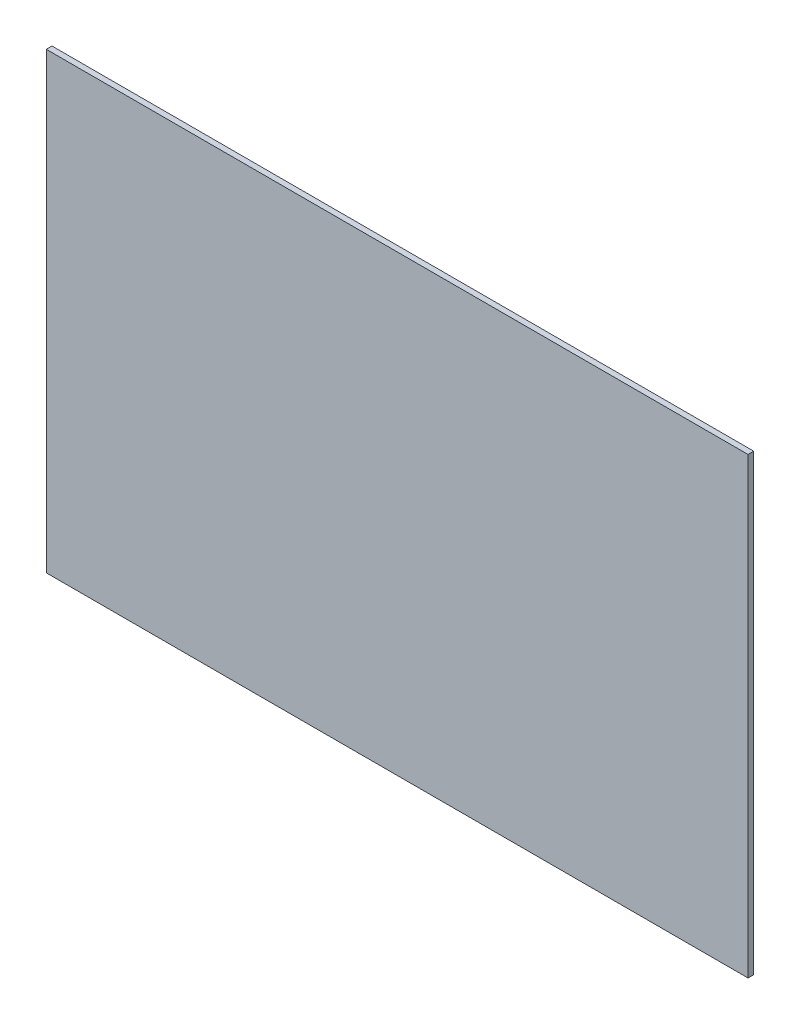
ISO-10303-21;
HEADER;
FILE_DESCRIPTION(('STEP AP214'),'2;1');
FILE_NAME('part.step','',(''),(''),'','','');
FILE_SCHEMA(('AUTOMOTIVE_DESIGN { 1 0 10303 214 1 1 1 1 }'));
ENDSEC;
DATA;
#1=APPLICATION_CONTEXT('core data for automotive mechanical design processes');
#2=APPLICATION_PROTOCOL_DEFINITION('international standard','automotive_design',2000,#1);
#3=PRODUCT_CONTEXT('',#1,'mechanical');
#4=PRODUCT('Part','Part','',(#3));
#5=PRODUCT_RELATED_PRODUCT_CATEGORY('part','',(#4));
#6=PRODUCT_DEFINITION_FORMATION('','',#4);
#7=PRODUCT_DEFINITION_CONTEXT('part definition',#1,'design');
#8=PRODUCT_DEFINITION('design','',#6,#7);
#9=PRODUCT_DEFINITION_SHAPE('','',#8);
#10=(LENGTH_UNIT() NAMED_UNIT(*) SI_UNIT(.MILLI.,.METRE.));
#11=(NAMED_UNIT(*) PLANE_ANGLE_UNIT() SI_UNIT($,.RADIAN.));
#12=(NAMED_UNIT(*) SI_UNIT($,.STERADIAN.) SOLID_ANGLE_UNIT());
#13=UNCERTAINTY_MEASURE_WITH_UNIT(LENGTH_MEASURE(1.E-05),#10,'distance_accuracy_value','');
#14=(GEOMETRIC_REPRESENTATION_CONTEXT(3) GLOBAL_UNCERTAINTY_ASSIGNED_CONTEXT((#13)) GLOBAL_UNIT_ASSIGNED_CONTEXT((#10,
#11,#12)) REPRESENTATION_CONTEXT('',''));
#15=CARTESIAN_POINT('',(0.,0.,0.));
#16=DIRECTION('',(0.,0.,1.));
#17=DIRECTION('',(1.,0.,0.));
#18=AXIS2_PLACEMENT_3D('',#15,#16,#17);
#19=CARTESIAN_POINT('',(399.85,-258.35,6.5));
#20=DIRECTION('',(-1.,0.,0.));
#21=DIRECTION('',(0.,0.,1.));
#22=AXIS2_PLACEMENT_3D('',#19,#20,#21);
#23=PLANE('',#22);
#24=DIRECTION('',(0.,1.,0.));
#25=VECTOR('',#24,1.);
#26=CARTESIAN_POINT('',(399.85,-258.35,0.));
#27=LINE('',#26,#25);
#28=CARTESIAN_POINT('',(399.85,-258.35,0.));
#29=VERTEX_POINT('',#28);
#30=CARTESIAN_POINT('',(399.85,258.35,0.));
#31=VERTEX_POINT('',#30);
#32=EDGE_CURVE('E96',#29,#31,#27,.T.);
#33=ORIENTED_EDGE('',*,*,#32,.T.);
#34=DIRECTION('',(0.,0.,-1.));
#35=VECTOR('',#34,1.);
#36=CARTESIAN_POINT('',(399.85,258.35,6.5));
#37=LINE('',#36,#35);
#38=CARTESIAN_POINT('',(399.85,258.35,6.5));
#39=VERTEX_POINT('',#38);
#40=EDGE_CURVE('E11',#39,#31,#37,.T.);
#41=ORIENTED_EDGE('',*,*,#40,.F.);
#42=DIRECTION('',(0.,1.,0.));
#43=VECTOR('',#42,1.);
#44=CARTESIAN_POINT('',(399.85,-258.35,6.5));
#45=LINE('',#44,#43);
#46=CARTESIAN_POINT('',(399.85,-258.35,6.5));
#47=VERTEX_POINT('',#46);
#48=EDGE_CURVE('E84',#47,#39,#45,.T.);
#49=ORIENTED_EDGE('',*,*,#48,.F.);
#50=DIRECTION('',(0.,0.,-1.));
#51=VECTOR('',#50,1.);
#52=CARTESIAN_POINT('',(399.85,-258.35,6.5));
#53=LINE('',#52,#51);
#54=EDGE_CURVE('E92',#47,#29,#53,.T.);
#55=ORIENTED_EDGE('',*,*,#54,.T.);
#56=EDGE_LOOP('',(#33,#41,#49,#55));
#57=FACE_BOUND('',#56,.T.);
#58=ADVANCED_FACE('F33',(#57),#23,.F.);
#59=CARTESIAN_POINT('',(-399.85,258.35,6.5));
#60=DIRECTION('',(0.,-1.,0.));
#61=DIRECTION('',(0.,0.,-1.));
#62=AXIS2_PLACEMENT_3D('',#59,#60,#61);
#63=PLANE('',#62);
#64=DIRECTION('',(-1.,0.,0.));
#65=VECTOR('',#64,1.);
#66=CARTESIAN_POINT('',(-399.85,258.35,0.));
#67=LINE('',#66,#65);
#68=CARTESIAN_POINT('',(-399.85,258.35,0.));
#69=VERTEX_POINT('',#68);
#70=EDGE_CURVE('E88',#31,#69,#67,.T.);
#71=ORIENTED_EDGE('',*,*,#70,.T.);
#72=DIRECTION('',(0.,0.,-1.));
#73=VECTOR('',#72,1.);
#74=CARTESIAN_POINT('',(-399.85,258.35,6.5));
#75=LINE('',#74,#73);
#76=CARTESIAN_POINT('',(-399.85,258.35,6.5));
#77=VERTEX_POINT('',#76);
#78=EDGE_CURVE('E41',#77,#69,#75,.T.);
#79=ORIENTED_EDGE('',*,*,#78,.F.);
#80=DIRECTION('',(-1.,0.,0.));
#81=VECTOR('',#80,1.);
#82=CARTESIAN_POINT('',(-399.85,258.35,6.5));
#83=LINE('',#82,#81);
#84=EDGE_CURVE('E79',#39,#77,#83,.T.);
#85=ORIENTED_EDGE('',*,*,#84,.F.);
#86=ORIENTED_EDGE('',*,*,#40,.T.);
#87=EDGE_LOOP('',(#71,#79,#85,#86));
#88=FACE_BOUND('',#87,.T.);
#89=ADVANCED_FACE('F87',(#88),#63,.F.);
#90=CARTESIAN_POINT('',(-399.85,-258.35,6.5));
#91=DIRECTION('',(1.,0.,0.));
#92=DIRECTION('',(0.,0.,-1.));
#93=AXIS2_PLACEMENT_3D('',#90,#91,#92);
#94=PLANE('',#93);
#95=DIRECTION('',(0.,-1.,0.));
#96=VECTOR('',#95,1.);
#97=CARTESIAN_POINT('',(-399.85,-258.35,0.));
#98=LINE('',#97,#96);
#99=CARTESIAN_POINT('',(-399.85,-258.35,0.));
#100=VERTEX_POINT('',#99);
#101=EDGE_CURVE('E66',#69,#100,#98,.T.);
#102=ORIENTED_EDGE('',*,*,#101,.T.);
#103=DIRECTION('',(0.,0.,-1.));
#104=VECTOR('',#103,1.);
#105=CARTESIAN_POINT('',(-399.85,-258.35,6.5));
#106=LINE('',#105,#104);
#107=CARTESIAN_POINT('',(-399.85,-258.35,6.5));
#108=VERTEX_POINT('',#107);
#109=EDGE_CURVE('E89',#108,#100,#106,.T.);
#110=ORIENTED_EDGE('',*,*,#109,.F.);
#111=DIRECTION('',(0.,-1.,0.));
#112=VECTOR('',#111,1.);
#113=CARTESIAN_POINT('',(-399.85,-258.35,6.5));
#114=LINE('',#113,#112);
#115=EDGE_CURVE('E82',#77,#108,#114,.T.);
#116=ORIENTED_EDGE('',*,*,#115,.F.);
#117=ORIENTED_EDGE('',*,*,#78,.T.);
#118=EDGE_LOOP('',(#102,#110,#116,#117));
#119=FACE_BOUND('',#118,.T.);
#120=ADVANCED_FACE('F90',(#119),#94,.F.);
#121=CARTESIAN_POINT('',(-399.85,-258.35,6.5));
#122=DIRECTION('',(0.,1.,0.));
#123=DIRECTION('',(0.,0.,1.));
#124=AXIS2_PLACEMENT_3D('',#121,#122,#123);
#125=PLANE('',#124);
#126=DIRECTION('',(1.,0.,0.));
#127=VECTOR('',#126,1.);
#128=CARTESIAN_POINT('',(-399.85,-258.35,0.));
#129=LINE('',#128,#127);
#130=EDGE_CURVE('E72',#100,#29,#129,.T.);
#131=ORIENTED_EDGE('',*,*,#130,.T.);
#132=ORIENTED_EDGE('',*,*,#54,.F.);
#133=DIRECTION('',(1.,0.,0.));
#134=VECTOR('',#133,1.);
#135=CARTESIAN_POINT('',(-399.85,-258.35,6.5));
#136=LINE('',#135,#134);
#137=EDGE_CURVE('E49',#108,#47,#136,.T.);
#138=ORIENTED_EDGE('',*,*,#137,.F.);
#139=ORIENTED_EDGE('',*,*,#109,.T.);
#140=EDGE_LOOP('',(#131,#132,#138,#139));
#141=FACE_BOUND('',#140,.T.);
#142=ADVANCED_FACE('F103',(#141),#125,.F.);
#143=CARTESIAN_POINT('',(0.,0.,6.5));
#144=DIRECTION('',(0.,0.,-1.));
#145=DIRECTION('',(-1.,0.,0.));
#146=AXIS2_PLACEMENT_3D('',#143,#144,#145);
#147=PLANE('',#146);
#148=ORIENTED_EDGE('',*,*,#48,.T.);
#149=ORIENTED_EDGE('',*,*,#84,.T.);
#150=ORIENTED_EDGE('',*,*,#115,.T.);
#151=ORIENTED_EDGE('',*,*,#137,.T.);
#152=EDGE_LOOP('',(#148,#149,#150,#151));
#153=FACE_BOUND('',#152,.T.);
#154=ADVANCED_FACE('F80',(#153),#147,.F.);
#155=CARTESIAN_POINT('',(0.,0.,0.));
#156=DIRECTION('',(0.,0.,-1.));
#157=DIRECTION('',(-1.,0.,0.));
#158=AXIS2_PLACEMENT_3D('',#155,#156,#157);
#159=PLANE('',#158);
#160=ORIENTED_EDGE('',*,*,#32,.F.);
#161=ORIENTED_EDGE('',*,*,#130,.F.);
#162=ORIENTED_EDGE('',*,*,#101,.F.);
#163=ORIENTED_EDGE('',*,*,#70,.F.);
#164=EDGE_LOOP('',(#160,#161,#162,#163));
#165=FACE_BOUND('',#164,.T.);
#166=ADVANCED_FACE('F106',(#165),#159,.T.);
#167=CLOSED_SHELL('',(#58,#89,#120,#142,#154,#166));
#168=MANIFOLD_SOLID_BREP('B2',#167);
#169=ADVANCED_BREP_SHAPE_REPRESENTATION('',(#18,#168),#14);
#170=SHAPE_DEFINITION_REPRESENTATION(#9,#169);
ENDSEC;
END-ISO-10303-21;
